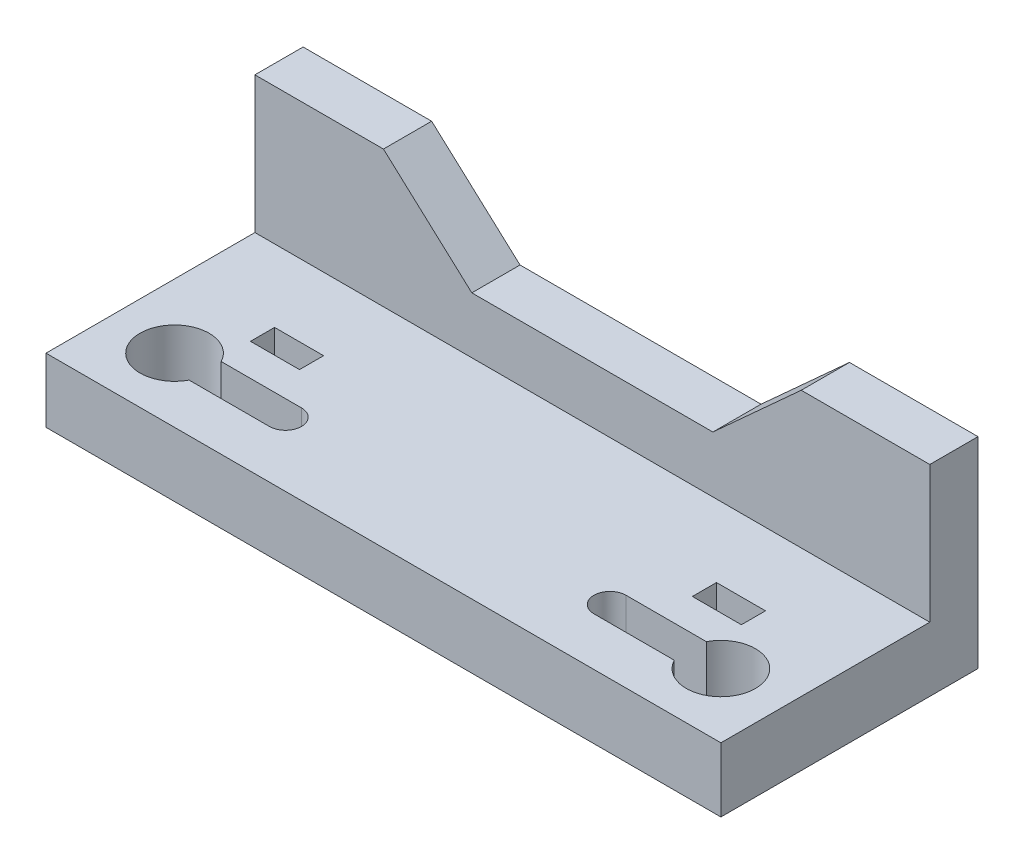
ISO-10303-21;
HEADER;
FILE_DESCRIPTION(('STEP AP214'),'2;1');
FILE_NAME('part.step','',(''),(''),'','','');
FILE_SCHEMA(('AUTOMOTIVE_DESIGN { 1 0 10303 214 1 1 1 1 }'));
ENDSEC;
DATA;
#1=APPLICATION_CONTEXT('core data for automotive mechanical design processes');
#2=APPLICATION_PROTOCOL_DEFINITION('international standard','automotive_design',2000,#1);
#3=PRODUCT_CONTEXT('',#1,'mechanical');
#4=PRODUCT('Part','Part','',(#3));
#5=PRODUCT_RELATED_PRODUCT_CATEGORY('part','',(#4));
#6=PRODUCT_DEFINITION_FORMATION('','',#4);
#7=PRODUCT_DEFINITION_CONTEXT('part definition',#1,'design');
#8=PRODUCT_DEFINITION('design','',#6,#7);
#9=PRODUCT_DEFINITION_SHAPE('','',#8);
#10=(LENGTH_UNIT() NAMED_UNIT(*) SI_UNIT(.MILLI.,.METRE.));
#11=(NAMED_UNIT(*) PLANE_ANGLE_UNIT() SI_UNIT($,.RADIAN.));
#12=(NAMED_UNIT(*) SI_UNIT($,.STERADIAN.) SOLID_ANGLE_UNIT());
#13=UNCERTAINTY_MEASURE_WITH_UNIT(LENGTH_MEASURE(1.E-05),#10,'distance_accuracy_value','');
#14=(GEOMETRIC_REPRESENTATION_CONTEXT(3) GLOBAL_UNCERTAINTY_ASSIGNED_CONTEXT((#13)) GLOBAL_UNIT_ASSIGNED_CONTEXT((#10,
#11,#12)) REPRESENTATION_CONTEXT('',''));
#15=CARTESIAN_POINT('',(0.,0.,0.));
#16=DIRECTION('',(0.,0.,1.));
#17=DIRECTION('',(1.,0.,0.));
#18=AXIS2_PLACEMENT_3D('',#15,#16,#17);
#19=CARTESIAN_POINT('',(0.,8.,0.));
#20=DIRECTION('',(0.,1.,0.));
#21=DIRECTION('',(0.,0.,1.));
#22=AXIS2_PLACEMENT_3D('',#19,#20,#21);
#23=PLANE('',#22);
#24=DIRECTION('',(1.,0.,0.));
#25=VECTOR('',#24,1.);
#26=CARTESIAN_POINT('',(0.,8.,-17.));
#27=LINE('',#26,#25);
#28=CARTESIAN_POINT('',(-30.55,8.,-17.));
#29=VERTEX_POINT('',#28);
#30=CARTESIAN_POINT('',(-24.45,8.,-17.));
#31=VERTEX_POINT('',#30);
#32=EDGE_CURVE('E192',#29,#31,#27,.T.);
#33=ORIENTED_EDGE('',*,*,#32,.T.);
#34=DIRECTION('',(0.,0.,1.));
#35=VECTOR('',#34,1.);
#36=CARTESIAN_POINT('',(-24.45,8.,0.));
#37=LINE('',#36,#35);
#38=CARTESIAN_POINT('',(-24.45,8.,-14.));
#39=VERTEX_POINT('',#38);
#40=EDGE_CURVE('E186',#31,#39,#37,.T.);
#41=ORIENTED_EDGE('',*,*,#40,.T.);
#42=DIRECTION('',(1.,0.,0.));
#43=VECTOR('',#42,1.);
#44=CARTESIAN_POINT('',(0.,8.,-14.));
#45=LINE('',#44,#43);
#46=CARTESIAN_POINT('',(-30.55,8.,-14.));
#47=VERTEX_POINT('',#46);
#48=EDGE_CURVE('E191',#47,#39,#45,.T.);
#49=ORIENTED_EDGE('',*,*,#48,.F.);
#50=DIRECTION('',(0.,0.,1.));
#51=VECTOR('',#50,1.);
#52=CARTESIAN_POINT('',(-30.55,8.,0.));
#53=LINE('',#52,#51);
#54=EDGE_CURVE('E205',#29,#47,#53,.T.);
#55=ORIENTED_EDGE('',*,*,#54,.F.);
#56=EDGE_LOOP('',(#33,#41,#49,#55));
#57=FACE_BOUND('',#56,.T.);
#58=DIRECTION('',(-1.,0.,0.));
#59=VECTOR('',#58,1.);
#60=CARTESIAN_POINT('',(0.,8.,-17.));
#61=LINE('',#60,#59);
#62=CARTESIAN_POINT('',(30.55,8.,-17.));
#63=VERTEX_POINT('',#62);
#64=CARTESIAN_POINT('',(24.45,8.,-17.));
#65=VERTEX_POINT('',#64);
#66=EDGE_CURVE('E405',#63,#65,#61,.T.);
#67=ORIENTED_EDGE('',*,*,#66,.F.);
#68=DIRECTION('',(0.,0.,1.));
#69=VECTOR('',#68,1.);
#70=CARTESIAN_POINT('',(30.55,8.,0.));
#71=LINE('',#70,#69);
#72=CARTESIAN_POINT('',(30.55,8.,-14.));
#73=VERTEX_POINT('',#72);
#74=EDGE_CURVE('E408',#63,#73,#71,.T.);
#75=ORIENTED_EDGE('',*,*,#74,.T.);
#76=DIRECTION('',(-1.,0.,0.));
#77=VECTOR('',#76,1.);
#78=CARTESIAN_POINT('',(0.,8.,-14.));
#79=LINE('',#78,#77);
#80=CARTESIAN_POINT('',(24.45,8.,-14.));
#81=VERTEX_POINT('',#80);
#82=EDGE_CURVE('E411',#73,#81,#79,.T.);
#83=ORIENTED_EDGE('',*,*,#82,.T.);
#84=DIRECTION('',(0.,0.,1.));
#85=VECTOR('',#84,1.);
#86=CARTESIAN_POINT('',(24.45,8.,0.));
#87=LINE('',#86,#85);
#88=EDGE_CURVE('E412',#65,#81,#87,.T.);
#89=ORIENTED_EDGE('',*,*,#88,.F.);
#90=EDGE_LOOP('',(#67,#75,#83,#89));
#91=FACE_BOUND('',#90,.T.);
#92=CARTESIAN_POINT('',(-34.,8.,-8.));
#93=DIRECTION('',(0.,1.,0.));
#94=DIRECTION('',(0.,0.,1.));
#95=AXIS2_PLACEMENT_3D('',#92,#93,#94);
#96=CIRCLE('',#95,4.3);
#97=CARTESIAN_POINT('',(-30.1934267378651,8.,-10.));
#98=VERTEX_POINT('',#97);
#99=CARTESIAN_POINT('',(-30.1934267378651,8.,-6.));
#100=VERTEX_POINT('',#99);
#101=EDGE_CURVE('E394',#98,#100,#96,.T.);
#102=ORIENTED_EDGE('',*,*,#101,.F.);
#103=DIRECTION('',(1.,0.,0.));
#104=VECTOR('',#103,1.);
#105=CARTESIAN_POINT('',(0.,8.,-9.99999999999999));
#106=LINE('',#105,#104);
#107=CARTESIAN_POINT('',(-20.1934267378651,8.,-10.));
#108=VERTEX_POINT('',#107);
#109=EDGE_CURVE('E397',#98,#108,#106,.T.);
#110=ORIENTED_EDGE('',*,*,#109,.T.);
#111=CARTESIAN_POINT('',(-20.1934267378651,8.,-8.));
#112=DIRECTION('',(0.,1.,0.));
#113=DIRECTION('',(0.,0.,1.));
#114=AXIS2_PLACEMENT_3D('',#111,#112,#113);
#115=CIRCLE('',#114,2.);
#116=CARTESIAN_POINT('',(-20.1934267378651,8.,-6.));
#117=VERTEX_POINT('',#116);
#118=EDGE_CURVE('E400',#108,#117,#115,.F.);
#119=ORIENTED_EDGE('',*,*,#118,.T.);
#120=DIRECTION('',(1.,0.,0.));
#121=VECTOR('',#120,1.);
#122=CARTESIAN_POINT('',(0.,8.,-6.00000000000001));
#123=LINE('',#122,#121);
#124=EDGE_CURVE('E402',#100,#117,#123,.T.);
#125=ORIENTED_EDGE('',*,*,#124,.F.);
#126=EDGE_LOOP('',(#102,#110,#119,#125));
#127=FACE_BOUND('',#126,.T.);
#128=CARTESIAN_POINT('',(20.1934267378651,8.,-8.00000000000001));
#129=DIRECTION('',(0.,1.,0.));
#130=DIRECTION('',(0.,0.,1.));
#131=AXIS2_PLACEMENT_3D('',#128,#129,#130);
#132=CIRCLE('',#131,1.99999999999999);
#133=CARTESIAN_POINT('',(20.1934267378651,8.,-9.99999999999999));
#134=VERTEX_POINT('',#133);
#135=CARTESIAN_POINT('',(20.1934267378651,8.,-6.00000000000001));
#136=VERTEX_POINT('',#135);
#137=EDGE_CURVE('E267',#134,#136,#132,.T.);
#138=ORIENTED_EDGE('',*,*,#137,.F.);
#139=DIRECTION('',(-1.,0.,0.));
#140=VECTOR('',#139,1.);
#141=CARTESIAN_POINT('',(0.,8.,-10.));
#142=LINE('',#141,#140);
#143=CARTESIAN_POINT('',(30.1934267378651,8.,-9.99999999999999));
#144=VERTEX_POINT('',#143);
#145=EDGE_CURVE('E387',#144,#134,#142,.T.);
#146=ORIENTED_EDGE('',*,*,#145,.F.);
#147=CARTESIAN_POINT('',(34.,8.,-8.00000000000001));
#148=DIRECTION('',(0.,1.,0.));
#149=DIRECTION('',(0.,0.,1.));
#150=AXIS2_PLACEMENT_3D('',#147,#148,#149);
#151=CIRCLE('',#150,4.3);
#152=CARTESIAN_POINT('',(30.1934267378651,8.,-6.00000000000001));
#153=VERTEX_POINT('',#152);
#154=EDGE_CURVE('E390',#144,#153,#151,.F.);
#155=ORIENTED_EDGE('',*,*,#154,.T.);
#156=DIRECTION('',(-1.,0.,0.));
#157=VECTOR('',#156,1.);
#158=CARTESIAN_POINT('',(0.,8.,-6.00000000000001));
#159=LINE('',#158,#157);
#160=EDGE_CURVE('E392',#153,#136,#159,.T.);
#161=ORIENTED_EDGE('',*,*,#160,.T.);
#162=EDGE_LOOP('',(#138,#146,#155,#161));
#163=FACE_BOUND('',#162,.T.);
#164=DIRECTION('',(0.,0.,-1.));
#165=VECTOR('',#164,1.);
#166=CARTESIAN_POINT('',(42.,8.,0.));
#167=LINE('',#166,#165);
#168=CARTESIAN_POINT('',(42.,8.,0.));
#169=VERTEX_POINT('',#168);
#170=CARTESIAN_POINT('',(42.,8.,-26.));
#171=VERTEX_POINT('',#170);
#172=EDGE_CURVE('E304',#169,#171,#167,.T.);
#173=ORIENTED_EDGE('',*,*,#172,.T.);
#174=DIRECTION('',(-1.,0.,0.));
#175=VECTOR('',#174,1.);
#176=CARTESIAN_POINT('',(-42.,8.,-26.));
#177=LINE('',#176,#175);
#178=CARTESIAN_POINT('',(-42.,8.,-26.));
#179=VERTEX_POINT('',#178);
#180=EDGE_CURVE('E327',#171,#179,#177,.T.);
#181=ORIENTED_EDGE('',*,*,#180,.T.);
#182=DIRECTION('',(0.,0.,-1.));
#183=VECTOR('',#182,1.);
#184=CARTESIAN_POINT('',(-42.,8.,0.));
#185=LINE('',#184,#183);
#186=CARTESIAN_POINT('',(-42.,8.,0.));
#187=VERTEX_POINT('',#186);
#188=EDGE_CURVE('E308',#187,#179,#185,.T.);
#189=ORIENTED_EDGE('',*,*,#188,.F.);
#190=DIRECTION('',(1.,0.,0.));
#191=VECTOR('',#190,1.);
#192=CARTESIAN_POINT('',(0.,8.,0.));
#193=LINE('',#192,#191);
#194=EDGE_CURVE('E309',#187,#169,#193,.T.);
#195=ORIENTED_EDGE('',*,*,#194,.T.);
#196=EDGE_LOOP('',(#173,#181,#189,#195));
#197=FACE_BOUND('',#196,.T.);
#198=ADVANCED_FACE('F35',(#57,#91,#127,#163,#197),#23,.T.);
#199=CARTESIAN_POINT('',(0.,8.,-17.));
#200=DIRECTION('',(0.,0.,-1.));
#201=DIRECTION('',(-1.,0.,0.));
#202=AXIS2_PLACEMENT_3D('',#199,#200,#201);
#203=PLANE('',#202);
#204=DIRECTION('',(1.,0.,0.));
#205=VECTOR('',#204,1.);
#206=CARTESIAN_POINT('',(0.,0.,-17.));
#207=LINE('',#206,#205);
#208=CARTESIAN_POINT('',(-30.55,0.,-17.));
#209=VERTEX_POINT('',#208);
#210=CARTESIAN_POINT('',(-24.45,0.,-17.));
#211=VERTEX_POINT('',#210);
#212=EDGE_CURVE('E259',#209,#211,#207,.T.);
#213=ORIENTED_EDGE('',*,*,#212,.T.);
#214=DIRECTION('',(0.,-1.,0.));
#215=VECTOR('',#214,1.);
#216=CARTESIAN_POINT('',(-24.45,8.,-17.));
#217=LINE('',#216,#215);
#218=EDGE_CURVE('E11',#31,#211,#217,.T.);
#219=ORIENTED_EDGE('',*,*,#218,.F.);
#220=ORIENTED_EDGE('',*,*,#32,.F.);
#221=DIRECTION('',(0.,-1.,0.));
#222=VECTOR('',#221,1.);
#223=CARTESIAN_POINT('',(-30.55,8.,-17.));
#224=LINE('',#223,#222);
#225=EDGE_CURVE('E61',#29,#209,#224,.T.);
#226=ORIENTED_EDGE('',*,*,#225,.T.);
#227=EDGE_LOOP('',(#213,#219,#220,#226));
#228=FACE_BOUND('',#227,.T.);
#229=ADVANCED_FACE('F445',(#228),#203,.F.);
#230=CARTESIAN_POINT('',(-24.45,8.,0.));
#231=DIRECTION('',(1.,0.,0.));
#232=DIRECTION('',(0.,0.,-1.));
#233=AXIS2_PLACEMENT_3D('',#230,#231,#232);
#234=PLANE('',#233);
#235=DIRECTION('',(0.,0.,1.));
#236=VECTOR('',#235,1.);
#237=CARTESIAN_POINT('',(-24.45,0.,0.));
#238=LINE('',#237,#236);
#239=CARTESIAN_POINT('',(-24.45,0.,-14.));
#240=VERTEX_POINT('',#239);
#241=EDGE_CURVE('E198',#211,#240,#238,.T.);
#242=ORIENTED_EDGE('',*,*,#241,.T.);
#243=DIRECTION('',(0.,-1.,0.));
#244=VECTOR('',#243,1.);
#245=CARTESIAN_POINT('',(-24.45,8.,-14.));
#246=LINE('',#245,#244);
#247=EDGE_CURVE('E44',#39,#240,#246,.T.);
#248=ORIENTED_EDGE('',*,*,#247,.F.);
#249=ORIENTED_EDGE('',*,*,#40,.F.);
#250=ORIENTED_EDGE('',*,*,#218,.T.);
#251=EDGE_LOOP('',(#242,#248,#249,#250));
#252=FACE_BOUND('',#251,.T.);
#253=ADVANCED_FACE('F197',(#252),#234,.F.);
#254=CARTESIAN_POINT('',(0.,8.,-14.));
#255=DIRECTION('',(0.,0.,-1.));
#256=DIRECTION('',(-1.,0.,0.));
#257=AXIS2_PLACEMENT_3D('',#254,#255,#256);
#258=PLANE('',#257);
#259=DIRECTION('',(1.,0.,0.));
#260=VECTOR('',#259,1.);
#261=CARTESIAN_POINT('',(0.,0.,-14.));
#262=LINE('',#261,#260);
#263=CARTESIAN_POINT('',(-30.55,0.,-14.));
#264=VERTEX_POINT('',#263);
#265=EDGE_CURVE('E262',#264,#240,#262,.T.);
#266=ORIENTED_EDGE('',*,*,#265,.F.);
#267=DIRECTION('',(0.,-1.,0.));
#268=VECTOR('',#267,1.);
#269=CARTESIAN_POINT('',(-30.55,8.,-14.));
#270=LINE('',#269,#268);
#271=EDGE_CURVE('E202',#47,#264,#270,.T.);
#272=ORIENTED_EDGE('',*,*,#271,.F.);
#273=ORIENTED_EDGE('',*,*,#48,.T.);
#274=ORIENTED_EDGE('',*,*,#247,.T.);
#275=EDGE_LOOP('',(#266,#272,#273,#274));
#276=FACE_BOUND('',#275,.T.);
#277=ADVANCED_FACE('F204',(#276),#258,.T.);
#278=CARTESIAN_POINT('',(0.,8.,0.));
#279=DIRECTION('',(0.,0.,-1.));
#280=DIRECTION('',(-1.,0.,0.));
#281=AXIS2_PLACEMENT_3D('',#278,#279,#280);
#282=PLANE('',#281);
#283=DIRECTION('',(1.,0.,0.));
#284=VECTOR('',#283,1.);
#285=CARTESIAN_POINT('',(0.,0.,0.));
#286=LINE('',#285,#284);
#287=CARTESIAN_POINT('',(-42.,0.,0.));
#288=VERTEX_POINT('',#287);
#289=CARTESIAN_POINT('',(42.,0.,0.));
#290=VERTEX_POINT('',#289);
#291=EDGE_CURVE('E247',#288,#290,#286,.T.);
#292=ORIENTED_EDGE('',*,*,#291,.T.);
#293=DIRECTION('',(0.,-1.,0.));
#294=VECTOR('',#293,1.);
#295=CARTESIAN_POINT('',(42.,8.,0.));
#296=LINE('',#295,#294);
#297=EDGE_CURVE('E269',#169,#290,#296,.T.);
#298=ORIENTED_EDGE('',*,*,#297,.F.);
#299=ORIENTED_EDGE('',*,*,#194,.F.);
#300=DIRECTION('',(0.,-1.,0.));
#301=VECTOR('',#300,1.);
#302=CARTESIAN_POINT('',(-42.,8.,0.));
#303=LINE('',#302,#301);
#304=EDGE_CURVE('E271',#187,#288,#303,.T.);
#305=ORIENTED_EDGE('',*,*,#304,.T.);
#306=EDGE_LOOP('',(#292,#298,#299,#305));
#307=FACE_BOUND('',#306,.T.);
#308=ADVANCED_FACE('F465',(#307),#282,.F.);
#309=CARTESIAN_POINT('',(42.,8.,0.));
#310=DIRECTION('',(-1.,0.,0.));
#311=DIRECTION('',(0.,0.,1.));
#312=AXIS2_PLACEMENT_3D('',#309,#310,#311);
#313=PLANE('',#312);
#314=DIRECTION('',(0.,0.,-1.));
#315=VECTOR('',#314,1.);
#316=CARTESIAN_POINT('',(42.,0.,0.));
#317=LINE('',#316,#315);
#318=CARTESIAN_POINT('',(42.,0.,-32.));
#319=VERTEX_POINT('',#318);
#320=EDGE_CURVE('E250',#290,#319,#317,.T.);
#321=ORIENTED_EDGE('',*,*,#320,.T.);
#322=DIRECTION('',(0.,-1.,0.));
#323=VECTOR('',#322,1.);
#324=CARTESIAN_POINT('',(42.,8.,-32.));
#325=LINE('',#324,#323);
#326=CARTESIAN_POINT('',(42.,25.,-32.));
#327=VERTEX_POINT('',#326);
#328=EDGE_CURVE('E276',#327,#319,#325,.T.);
#329=ORIENTED_EDGE('',*,*,#328,.F.);
#330=DIRECTION('',(0.,0.,-1.));
#331=VECTOR('',#330,1.);
#332=CARTESIAN_POINT('',(42.,25.,-26.));
#333=LINE('',#332,#331);
#334=CARTESIAN_POINT('',(42.,25.,-26.));
#335=VERTEX_POINT('',#334);
#336=EDGE_CURVE('E215',#335,#327,#333,.T.);
#337=ORIENTED_EDGE('',*,*,#336,.F.);
#338=DIRECTION('',(0.,-1.,0.));
#339=VECTOR('',#338,1.);
#340=CARTESIAN_POINT('',(42.,8.,-26.));
#341=LINE('',#340,#339);
#342=EDGE_CURVE('E357',#335,#171,#341,.T.);
#343=ORIENTED_EDGE('',*,*,#342,.T.);
#344=ORIENTED_EDGE('',*,*,#172,.F.);
#345=ORIENTED_EDGE('',*,*,#297,.T.);
#346=EDGE_LOOP('',(#321,#329,#337,#343,#344,#345));
#347=FACE_BOUND('',#346,.T.);
#348=ADVANCED_FACE('F473',(#347),#313,.F.);
#349=CARTESIAN_POINT('',(0.,8.,-32.));
#350=DIRECTION('',(0.,0.,-1.));
#351=DIRECTION('',(-1.,0.,0.));
#352=AXIS2_PLACEMENT_3D('',#349,#350,#351);
#353=PLANE('',#352);
#354=CARTESIAN_POINT('',(32.,15.,-32.));
#355=DIRECTION('',(0.,0.,-1.));
#356=DIRECTION('',(1.,0.,0.));
#357=AXIS2_PLACEMENT_3D('',#354,#355,#356);
#358=CIRCLE('',#357,5.5);
#359=CARTESIAN_POINT('',(37.5,15.,-32.));
#360=VERTEX_POINT('',#359);
#361=EDGE_CURVE('E811',#360,#360,#358,.T.);
#362=ORIENTED_EDGE('',*,*,#361,.F.);
#363=EDGE_LOOP('',(#362));
#364=FACE_BOUND('',#363,.T.);
#365=CARTESIAN_POINT('',(-32.,15.,-32.));
#366=DIRECTION('',(0.,0.,-1.));
#367=DIRECTION('',(-1.,0.,0.));
#368=AXIS2_PLACEMENT_3D('',#365,#366,#367);
#369=CIRCLE('',#368,5.5);
#370=CARTESIAN_POINT('',(-37.5,15.,-32.));
#371=VERTEX_POINT('',#370);
#372=EDGE_CURVE('E341',#371,#371,#369,.T.);
#373=ORIENTED_EDGE('',*,*,#372,.F.);
#374=EDGE_LOOP('',(#373));
#375=FACE_BOUND('',#374,.T.);
#376=DIRECTION('',(1.,0.,0.));
#377=VECTOR('',#376,1.);
#378=CARTESIAN_POINT('',(0.,0.,-32.));
#379=LINE('',#378,#377);
#380=CARTESIAN_POINT('',(-42.,0.,-32.));
#381=VERTEX_POINT('',#380);
#382=EDGE_CURVE('E253',#381,#319,#379,.T.);
#383=ORIENTED_EDGE('',*,*,#382,.F.);
#384=DIRECTION('',(0.,-1.,0.));
#385=VECTOR('',#384,1.);
#386=CARTESIAN_POINT('',(-42.,8.,-32.));
#387=LINE('',#386,#385);
#388=CARTESIAN_POINT('',(-42.,25.,-32.));
#389=VERTEX_POINT('',#388);
#390=EDGE_CURVE('E273',#389,#381,#387,.T.);
#391=ORIENTED_EDGE('',*,*,#390,.F.);
#392=DIRECTION('',(1.,0.,0.));
#393=VECTOR('',#392,1.);
#394=CARTESIAN_POINT('',(-26.,25.,-32.));
#395=LINE('',#394,#393);
#396=CARTESIAN_POINT('',(-26.,25.,-32.));
#397=VERTEX_POINT('',#396);
#398=EDGE_CURVE('E358',#389,#397,#395,.T.);
#399=ORIENTED_EDGE('',*,*,#398,.T.);
#400=DIRECTION('',(0.739940073395944,-0.672672793996312,0.));
#401=VECTOR('',#400,1.);
#402=CARTESIAN_POINT('',(-15.,15.,-32.));
#403=LINE('',#402,#401);
#404=CARTESIAN_POINT('',(-15.,15.,-32.));
#405=VERTEX_POINT('',#404);
#406=EDGE_CURVE('E361',#397,#405,#403,.T.);
#407=ORIENTED_EDGE('',*,*,#406,.T.);
#408=DIRECTION('',(1.,0.,0.));
#409=VECTOR('',#408,1.);
#410=CARTESIAN_POINT('',(15.,15.,-32.));
#411=LINE('',#410,#409);
#412=CARTESIAN_POINT('',(15.,15.,-32.));
#413=VERTEX_POINT('',#412);
#414=EDGE_CURVE('E365',#405,#413,#411,.T.);
#415=ORIENTED_EDGE('',*,*,#414,.T.);
#416=DIRECTION('',(0.739940073395944,0.672672793996312,0.));
#417=VECTOR('',#416,1.);
#418=CARTESIAN_POINT('',(26.,25.,-32.));
#419=LINE('',#418,#417);
#420=CARTESIAN_POINT('',(26.,25.,-32.));
#421=VERTEX_POINT('',#420);
#422=EDGE_CURVE('E334',#413,#421,#419,.T.);
#423=ORIENTED_EDGE('',*,*,#422,.T.);
#424=DIRECTION('',(1.,0.,0.));
#425=VECTOR('',#424,1.);
#426=CARTESIAN_POINT('',(42.,25.,-32.));
#427=LINE('',#426,#425);
#428=EDGE_CURVE('E330',#421,#327,#427,.T.);
#429=ORIENTED_EDGE('',*,*,#428,.T.);
#430=ORIENTED_EDGE('',*,*,#328,.T.);
#431=EDGE_LOOP('',(#383,#391,#399,#407,#415,#423,#429,#430));
#432=FACE_BOUND('',#431,.T.);
#433=ADVANCED_FACE('F442',(#364,#375,#432),#353,.T.);
#434=CARTESIAN_POINT('',(0.,8.,-17.));
#435=DIRECTION('',(0.,0.,1.));
#436=DIRECTION('',(1.,0.,0.));
#437=AXIS2_PLACEMENT_3D('',#434,#435,#436);
#438=PLANE('',#437);
#439=DIRECTION('',(-1.,0.,0.));
#440=VECTOR('',#439,1.);
#441=CARTESIAN_POINT('',(0.,0.,-17.));
#442=LINE('',#441,#440);
#443=CARTESIAN_POINT('',(30.55,0.,-17.));
#444=VERTEX_POINT('',#443);
#445=CARTESIAN_POINT('',(24.45,0.,-17.));
#446=VERTEX_POINT('',#445);
#447=EDGE_CURVE('E235',#444,#446,#442,.T.);
#448=ORIENTED_EDGE('',*,*,#447,.F.);
#449=DIRECTION('',(0.,-1.,0.));
#450=VECTOR('',#449,1.);
#451=CARTESIAN_POINT('',(30.55,8.,-17.));
#452=LINE('',#451,#450);
#453=EDGE_CURVE('E274',#63,#444,#452,.T.);
#454=ORIENTED_EDGE('',*,*,#453,.F.);
#455=ORIENTED_EDGE('',*,*,#66,.T.);
#456=DIRECTION('',(0.,-1.,0.));
#457=VECTOR('',#456,1.);
#458=CARTESIAN_POINT('',(24.45,8.,-17.));
#459=LINE('',#458,#457);
#460=EDGE_CURVE('E280',#65,#446,#459,.T.);
#461=ORIENTED_EDGE('',*,*,#460,.T.);
#462=EDGE_LOOP('',(#448,#454,#455,#461));
#463=FACE_BOUND('',#462,.T.);
#464=ADVANCED_FACE('F431',(#463),#438,.T.);
#465=CARTESIAN_POINT('',(30.55,8.,0.));
#466=DIRECTION('',(1.,0.,0.));
#467=DIRECTION('',(0.,0.,-1.));
#468=AXIS2_PLACEMENT_3D('',#465,#466,#467);
#469=PLANE('',#468);
#470=DIRECTION('',(0.,0.,1.));
#471=VECTOR('',#470,1.);
#472=CARTESIAN_POINT('',(30.55,0.,0.));
#473=LINE('',#472,#471);
#474=CARTESIAN_POINT('',(30.55,0.,-14.));
#475=VERTEX_POINT('',#474);
#476=EDGE_CURVE('E238',#444,#475,#473,.T.);
#477=ORIENTED_EDGE('',*,*,#476,.T.);
#478=DIRECTION('',(0.,-1.,0.));
#479=VECTOR('',#478,1.);
#480=CARTESIAN_POINT('',(30.55,8.,-14.));
#481=LINE('',#480,#479);
#482=EDGE_CURVE('E285',#73,#475,#481,.T.);
#483=ORIENTED_EDGE('',*,*,#482,.F.);
#484=ORIENTED_EDGE('',*,*,#74,.F.);
#485=ORIENTED_EDGE('',*,*,#453,.T.);
#486=EDGE_LOOP('',(#477,#483,#484,#485));
#487=FACE_BOUND('',#486,.T.);
#488=ADVANCED_FACE('F433',(#487),#469,.F.);
#489=CARTESIAN_POINT('',(0.,8.,-14.));
#490=DIRECTION('',(0.,0.,1.));
#491=DIRECTION('',(1.,0.,0.));
#492=AXIS2_PLACEMENT_3D('',#489,#490,#491);
#493=PLANE('',#492);
#494=DIRECTION('',(-1.,0.,0.));
#495=VECTOR('',#494,1.);
#496=CARTESIAN_POINT('',(0.,0.,-14.));
#497=LINE('',#496,#495);
#498=CARTESIAN_POINT('',(24.45,0.,-14.));
#499=VERTEX_POINT('',#498);
#500=EDGE_CURVE('E241',#475,#499,#497,.T.);
#501=ORIENTED_EDGE('',*,*,#500,.T.);
#502=DIRECTION('',(0.,-1.,0.));
#503=VECTOR('',#502,1.);
#504=CARTESIAN_POINT('',(24.45,8.,-14.));
#505=LINE('',#504,#503);
#506=EDGE_CURVE('E282',#81,#499,#505,.T.);
#507=ORIENTED_EDGE('',*,*,#506,.F.);
#508=ORIENTED_EDGE('',*,*,#82,.F.);
#509=ORIENTED_EDGE('',*,*,#482,.T.);
#510=EDGE_LOOP('',(#501,#507,#508,#509));
#511=FACE_BOUND('',#510,.T.);
#512=ADVANCED_FACE('F424',(#511),#493,.F.);
#513=CARTESIAN_POINT('',(-34.,8.,-8.));
#514=DIRECTION('',(0.,-1.,0.));
#515=DIRECTION('',(0.,0.,-1.));
#516=AXIS2_PLACEMENT_3D('',#513,#514,#515);
#517=CYLINDRICAL_SURFACE('',#516,4.3);
#518=CARTESIAN_POINT('',(-34.,0.,-8.));
#519=DIRECTION('',(0.,1.,0.));
#520=DIRECTION('',(0.,0.,1.));
#521=AXIS2_PLACEMENT_3D('',#518,#519,#520);
#522=CIRCLE('',#521,4.3);
#523=CARTESIAN_POINT('',(-30.1934267378651,0.,-10.));
#524=VERTEX_POINT('',#523);
#525=CARTESIAN_POINT('',(-30.1934267378651,0.,-6.));
#526=VERTEX_POINT('',#525);
#527=EDGE_CURVE('E223',#524,#526,#522,.T.);
#528=ORIENTED_EDGE('',*,*,#527,.F.);
#529=DIRECTION('',(0.,-1.,0.));
#530=VECTOR('',#529,1.);
#531=CARTESIAN_POINT('',(-30.1934267378651,8.,-10.));
#532=LINE('',#531,#530);
#533=EDGE_CURVE('E283',#98,#524,#532,.T.);
#534=ORIENTED_EDGE('',*,*,#533,.F.);
#535=ORIENTED_EDGE('',*,*,#101,.T.);
#536=DIRECTION('',(0.,-1.,0.));
#537=VECTOR('',#536,1.);
#538=CARTESIAN_POINT('',(-30.1934267378651,8.,-6.));
#539=LINE('',#538,#537);
#540=EDGE_CURVE('E289',#100,#526,#539,.T.);
#541=ORIENTED_EDGE('',*,*,#540,.T.);
#542=EDGE_LOOP('',(#528,#534,#535,#541));
#543=FACE_BOUND('',#542,.T.);
#544=ADVANCED_FACE('F440',(#543),#517,.F.);
#545=CARTESIAN_POINT('',(0.,8.,-9.99999999999999));
#546=DIRECTION('',(0.,0.,-1.));
#547=DIRECTION('',(-1.,0.,0.));
#548=AXIS2_PLACEMENT_3D('',#545,#546,#547);
#549=PLANE('',#548);
#550=DIRECTION('',(1.,0.,0.));
#551=VECTOR('',#550,1.);
#552=CARTESIAN_POINT('',(0.,0.,-9.99999999999999));
#553=LINE('',#552,#551);
#554=CARTESIAN_POINT('',(-20.1934267378651,0.,-10.));
#555=VERTEX_POINT('',#554);
#556=EDGE_CURVE('E226',#524,#555,#553,.T.);
#557=ORIENTED_EDGE('',*,*,#556,.T.);
#558=DIRECTION('',(0.,-1.,0.));
#559=VECTOR('',#558,1.);
#560=CARTESIAN_POINT('',(-20.1934267378651,8.,-10.));
#561=LINE('',#560,#559);
#562=EDGE_CURVE('E293',#108,#555,#561,.T.);
#563=ORIENTED_EDGE('',*,*,#562,.F.);
#564=ORIENTED_EDGE('',*,*,#109,.F.);
#565=ORIENTED_EDGE('',*,*,#533,.T.);
#566=EDGE_LOOP('',(#557,#563,#564,#565));
#567=FACE_BOUND('',#566,.T.);
#568=ADVANCED_FACE('F498',(#567),#549,.F.);
#569=CARTESIAN_POINT('',(-20.1934267378651,8.,-8.));
#570=DIRECTION('',(0.,-1.,0.));
#571=DIRECTION('',(0.,0.,-1.));
#572=AXIS2_PLACEMENT_3D('',#569,#570,#571);
#573=CYLINDRICAL_SURFACE('',#572,2.);
#574=CARTESIAN_POINT('',(-20.1934267378651,0.,-8.));
#575=DIRECTION('',(0.,1.,0.));
#576=DIRECTION('',(0.,0.,1.));
#577=AXIS2_PLACEMENT_3D('',#574,#575,#576);
#578=CIRCLE('',#577,2.);
#579=CARTESIAN_POINT('',(-20.1934267378651,0.,-6.));
#580=VERTEX_POINT('',#579);
#581=EDGE_CURVE('E229',#555,#580,#578,.F.);
#582=ORIENTED_EDGE('',*,*,#581,.T.);
#583=DIRECTION('',(0.,-1.,0.));
#584=VECTOR('',#583,1.);
#585=CARTESIAN_POINT('',(-20.1934267378651,8.,-6.));
#586=LINE('',#585,#584);
#587=EDGE_CURVE('E291',#117,#580,#586,.T.);
#588=ORIENTED_EDGE('',*,*,#587,.F.);
#589=ORIENTED_EDGE('',*,*,#118,.F.);
#590=ORIENTED_EDGE('',*,*,#562,.T.);
#591=EDGE_LOOP('',(#582,#588,#589,#590));
#592=FACE_BOUND('',#591,.T.);
#593=ADVANCED_FACE('F495',(#592),#573,.F.);
#594=CARTESIAN_POINT('',(20.1934267378651,8.,-8.00000000000001));
#595=DIRECTION('',(0.,-1.,0.));
#596=DIRECTION('',(0.,0.,-1.));
#597=AXIS2_PLACEMENT_3D('',#594,#595,#596);
#598=CYLINDRICAL_SURFACE('',#597,1.99999999999999);
#599=CARTESIAN_POINT('',(20.1934267378651,0.,-8.00000000000001));
#600=DIRECTION('',(0.,1.,0.));
#601=DIRECTION('',(0.,0.,1.));
#602=AXIS2_PLACEMENT_3D('',#599,#600,#601);
#603=CIRCLE('',#602,1.99999999999999);
#604=CARTESIAN_POINT('',(20.1934267378651,0.,-9.99999999999999));
#605=VERTEX_POINT('',#604);
#606=CARTESIAN_POINT('',(20.1934267378651,0.,-6.00000000000001));
#607=VERTEX_POINT('',#606);
#608=EDGE_CURVE('E211',#605,#607,#603,.T.);
#609=ORIENTED_EDGE('',*,*,#608,.F.);
#610=DIRECTION('',(0.,-1.,0.));
#611=VECTOR('',#610,1.);
#612=CARTESIAN_POINT('',(20.1934267378651,8.,-9.99999999999999));
#613=LINE('',#612,#611);
#614=EDGE_CURVE('E136',#134,#605,#613,.T.);
#615=ORIENTED_EDGE('',*,*,#614,.F.);
#616=ORIENTED_EDGE('',*,*,#137,.T.);
#617=DIRECTION('',(0.,-1.,0.));
#618=VECTOR('',#617,1.);
#619=CARTESIAN_POINT('',(20.1934267378651,8.,-6.00000000000001));
#620=LINE('',#619,#618);
#621=EDGE_CURVE('E207',#136,#607,#620,.T.);
#622=ORIENTED_EDGE('',*,*,#621,.T.);
#623=EDGE_LOOP('',(#609,#615,#616,#622));
#624=FACE_BOUND('',#623,.T.);
#625=ADVANCED_FACE('F37',(#624),#598,.F.);
#626=CARTESIAN_POINT('',(0.,8.,-10.));
#627=DIRECTION('',(0.,0.,1.));
#628=DIRECTION('',(1.,0.,0.));
#629=AXIS2_PLACEMENT_3D('',#626,#627,#628);
#630=PLANE('',#629);
#631=DIRECTION('',(-1.,0.,0.));
#632=VECTOR('',#631,1.);
#633=CARTESIAN_POINT('',(0.,0.,-10.));
#634=LINE('',#633,#632);
#635=CARTESIAN_POINT('',(30.1934267378651,0.,-9.99999999999999));
#636=VERTEX_POINT('',#635);
#637=EDGE_CURVE('E214',#636,#605,#634,.T.);
#638=ORIENTED_EDGE('',*,*,#637,.F.);
#639=DIRECTION('',(0.,-1.,0.));
#640=VECTOR('',#639,1.);
#641=CARTESIAN_POINT('',(30.1934267378651,8.,-9.99999999999999));
#642=LINE('',#641,#640);
#643=EDGE_CURVE('E301',#144,#636,#642,.T.);
#644=ORIENTED_EDGE('',*,*,#643,.F.);
#645=ORIENTED_EDGE('',*,*,#145,.T.);
#646=ORIENTED_EDGE('',*,*,#614,.T.);
#647=EDGE_LOOP('',(#638,#644,#645,#646));
#648=FACE_BOUND('',#647,.T.);
#649=ADVANCED_FACE('F507',(#648),#630,.T.);
#650=CARTESIAN_POINT('',(34.,8.,-8.00000000000001));
#651=DIRECTION('',(0.,-1.,0.));
#652=DIRECTION('',(0.,0.,-1.));
#653=AXIS2_PLACEMENT_3D('',#650,#651,#652);
#654=CYLINDRICAL_SURFACE('',#653,4.3);
#655=CARTESIAN_POINT('',(34.,0.,-8.00000000000001));
#656=DIRECTION('',(0.,1.,0.));
#657=DIRECTION('',(0.,0.,1.));
#658=AXIS2_PLACEMENT_3D('',#655,#656,#657);
#659=CIRCLE('',#658,4.3);
#660=CARTESIAN_POINT('',(30.1934267378651,0.,-6.00000000000001));
#661=VERTEX_POINT('',#660);
#662=EDGE_CURVE('E218',#636,#661,#659,.F.);
#663=ORIENTED_EDGE('',*,*,#662,.T.);
#664=DIRECTION('',(0.,-1.,0.));
#665=VECTOR('',#664,1.);
#666=CARTESIAN_POINT('',(30.1934267378651,8.,-6.00000000000001));
#667=LINE('',#666,#665);
#668=EDGE_CURVE('E298',#153,#661,#667,.T.);
#669=ORIENTED_EDGE('',*,*,#668,.F.);
#670=ORIENTED_EDGE('',*,*,#154,.F.);
#671=ORIENTED_EDGE('',*,*,#643,.T.);
#672=EDGE_LOOP('',(#663,#669,#670,#671));
#673=FACE_BOUND('',#672,.T.);
#674=ADVANCED_FACE('F470',(#673),#654,.F.);
#675=CARTESIAN_POINT('',(-42.,8.,0.));
#676=DIRECTION('',(-1.,0.,0.));
#677=DIRECTION('',(0.,0.,1.));
#678=AXIS2_PLACEMENT_3D('',#675,#676,#677);
#679=PLANE('',#678);
#680=DIRECTION('',(0.,0.,-1.));
#681=VECTOR('',#680,1.);
#682=CARTESIAN_POINT('',(-42.,0.,0.));
#683=LINE('',#682,#681);
#684=EDGE_CURVE('E256',#288,#381,#683,.T.);
#685=ORIENTED_EDGE('',*,*,#684,.F.);
#686=ORIENTED_EDGE('',*,*,#304,.F.);
#687=ORIENTED_EDGE('',*,*,#188,.T.);
#688=DIRECTION('',(0.,1.,0.));
#689=VECTOR('',#688,1.);
#690=CARTESIAN_POINT('',(-42.,25.,-26.));
#691=LINE('',#690,#689);
#692=CARTESIAN_POINT('',(-42.,25.,-26.));
#693=VERTEX_POINT('',#692);
#694=EDGE_CURVE('E52',#179,#693,#691,.T.);
#695=ORIENTED_EDGE('',*,*,#694,.T.);
#696=DIRECTION('',(0.,0.,-1.));
#697=VECTOR('',#696,1.);
#698=CARTESIAN_POINT('',(-42.,25.,-26.));
#699=LINE('',#698,#697);
#700=EDGE_CURVE('E384',#693,#389,#699,.T.);
#701=ORIENTED_EDGE('',*,*,#700,.T.);
#702=ORIENTED_EDGE('',*,*,#390,.T.);
#703=EDGE_LOOP('',(#685,#686,#687,#695,#701,#702));
#704=FACE_BOUND('',#703,.T.);
#705=ADVANCED_FACE('F320',(#704),#679,.T.);
#706=CARTESIAN_POINT('',(24.45,8.,0.));
#707=DIRECTION('',(1.,0.,0.));
#708=DIRECTION('',(0.,0.,-1.));
#709=AXIS2_PLACEMENT_3D('',#706,#707,#708);
#710=PLANE('',#709);
#711=DIRECTION('',(0.,0.,1.));
#712=VECTOR('',#711,1.);
#713=CARTESIAN_POINT('',(24.45,0.,0.));
#714=LINE('',#713,#712);
#715=EDGE_CURVE('E244',#446,#499,#714,.T.);
#716=ORIENTED_EDGE('',*,*,#715,.F.);
#717=ORIENTED_EDGE('',*,*,#460,.F.);
#718=ORIENTED_EDGE('',*,*,#88,.T.);
#719=ORIENTED_EDGE('',*,*,#506,.T.);
#720=EDGE_LOOP('',(#716,#717,#718,#719));
#721=FACE_BOUND('',#720,.T.);
#722=ADVANCED_FACE('F417',(#721),#710,.T.);
#723=CARTESIAN_POINT('',(0.,8.,-6.00000000000001));
#724=DIRECTION('',(0.,0.,-1.));
#725=DIRECTION('',(-1.,0.,0.));
#726=AXIS2_PLACEMENT_3D('',#723,#724,#725);
#727=PLANE('',#726);
#728=DIRECTION('',(1.,0.,0.));
#729=VECTOR('',#728,1.);
#730=CARTESIAN_POINT('',(0.,0.,-6.00000000000001));
#731=LINE('',#730,#729);
#732=EDGE_CURVE('E232',#526,#580,#731,.T.);
#733=ORIENTED_EDGE('',*,*,#732,.F.);
#734=ORIENTED_EDGE('',*,*,#540,.F.);
#735=ORIENTED_EDGE('',*,*,#124,.T.);
#736=ORIENTED_EDGE('',*,*,#587,.T.);
#737=EDGE_LOOP('',(#733,#734,#735,#736));
#738=FACE_BOUND('',#737,.T.);
#739=ADVANCED_FACE('F482',(#738),#727,.T.);
#740=CARTESIAN_POINT('',(0.,8.,-6.00000000000001));
#741=DIRECTION('',(0.,0.,1.));
#742=DIRECTION('',(1.,0.,0.));
#743=AXIS2_PLACEMENT_3D('',#740,#741,#742);
#744=PLANE('',#743);
#745=DIRECTION('',(-1.,0.,0.));
#746=VECTOR('',#745,1.);
#747=CARTESIAN_POINT('',(0.,0.,-6.00000000000001));
#748=LINE('',#747,#746);
#749=EDGE_CURVE('E220',#661,#607,#748,.T.);
#750=ORIENTED_EDGE('',*,*,#749,.T.);
#751=ORIENTED_EDGE('',*,*,#621,.F.);
#752=ORIENTED_EDGE('',*,*,#160,.F.);
#753=ORIENTED_EDGE('',*,*,#668,.T.);
#754=EDGE_LOOP('',(#750,#751,#752,#753));
#755=FACE_BOUND('',#754,.T.);
#756=ADVANCED_FACE('F462',(#755),#744,.F.);
#757=CARTESIAN_POINT('',(-30.55,8.,0.));
#758=DIRECTION('',(1.,0.,0.));
#759=DIRECTION('',(0.,0.,-1.));
#760=AXIS2_PLACEMENT_3D('',#757,#758,#759);
#761=PLANE('',#760);
#762=DIRECTION('',(0.,0.,1.));
#763=VECTOR('',#762,1.);
#764=CARTESIAN_POINT('',(-30.55,0.,0.));
#765=LINE('',#764,#763);
#766=EDGE_CURVE('E264',#209,#264,#765,.T.);
#767=ORIENTED_EDGE('',*,*,#766,.F.);
#768=ORIENTED_EDGE('',*,*,#225,.F.);
#769=ORIENTED_EDGE('',*,*,#54,.T.);
#770=ORIENTED_EDGE('',*,*,#271,.T.);
#771=EDGE_LOOP('',(#767,#768,#769,#770));
#772=FACE_BOUND('',#771,.T.);
#773=ADVANCED_FACE('F458',(#772),#761,.T.);
#774=CARTESIAN_POINT('',(0.,0.,0.));
#775=DIRECTION('',(0.,1.,0.));
#776=DIRECTION('',(0.,0.,1.));
#777=AXIS2_PLACEMENT_3D('',#774,#775,#776);
#778=PLANE('',#777);
#779=ORIENTED_EDGE('',*,*,#608,.T.);
#780=ORIENTED_EDGE('',*,*,#749,.F.);
#781=ORIENTED_EDGE('',*,*,#662,.F.);
#782=ORIENTED_EDGE('',*,*,#637,.T.);
#783=EDGE_LOOP('',(#779,#780,#781,#782));
#784=FACE_BOUND('',#783,.T.);
#785=ORIENTED_EDGE('',*,*,#527,.T.);
#786=ORIENTED_EDGE('',*,*,#732,.T.);
#787=ORIENTED_EDGE('',*,*,#581,.F.);
#788=ORIENTED_EDGE('',*,*,#556,.F.);
#789=EDGE_LOOP('',(#785,#786,#787,#788));
#790=FACE_BOUND('',#789,.T.);
#791=ORIENTED_EDGE('',*,*,#447,.T.);
#792=ORIENTED_EDGE('',*,*,#715,.T.);
#793=ORIENTED_EDGE('',*,*,#500,.F.);
#794=ORIENTED_EDGE('',*,*,#476,.F.);
#795=EDGE_LOOP('',(#791,#792,#793,#794));
#796=FACE_BOUND('',#795,.T.);
#797=ORIENTED_EDGE('',*,*,#291,.F.);
#798=ORIENTED_EDGE('',*,*,#684,.T.);
#799=ORIENTED_EDGE('',*,*,#382,.T.);
#800=ORIENTED_EDGE('',*,*,#320,.F.);
#801=EDGE_LOOP('',(#797,#798,#799,#800));
#802=FACE_BOUND('',#801,.T.);
#803=ORIENTED_EDGE('',*,*,#212,.F.);
#804=ORIENTED_EDGE('',*,*,#766,.T.);
#805=ORIENTED_EDGE('',*,*,#265,.T.);
#806=ORIENTED_EDGE('',*,*,#241,.F.);
#807=EDGE_LOOP('',(#803,#804,#805,#806));
#808=FACE_BOUND('',#807,.T.);
#809=ADVANCED_FACE('F427',(#784,#790,#796,#802,#808),#778,.F.);
#810=CARTESIAN_POINT('',(42.,25.,-26.));
#811=DIRECTION('',(0.,1.,0.));
#812=DIRECTION('',(0.,0.,1.));
#813=AXIS2_PLACEMENT_3D('',#810,#811,#812);
#814=PLANE('',#813);
#815=ORIENTED_EDGE('',*,*,#428,.F.);
#816=DIRECTION('',(0.,0.,-1.));
#817=VECTOR('',#816,1.);
#818=CARTESIAN_POINT('',(26.,25.,-26.));
#819=LINE('',#818,#817);
#820=CARTESIAN_POINT('',(26.,25.,-26.));
#821=VERTEX_POINT('',#820);
#822=EDGE_CURVE('E372',#821,#421,#819,.T.);
#823=ORIENTED_EDGE('',*,*,#822,.F.);
#824=DIRECTION('',(1.,0.,0.));
#825=VECTOR('',#824,1.);
#826=CARTESIAN_POINT('',(42.,25.,-26.));
#827=LINE('',#826,#825);
#828=EDGE_CURVE('E354',#821,#335,#827,.T.);
#829=ORIENTED_EDGE('',*,*,#828,.T.);
#830=ORIENTED_EDGE('',*,*,#336,.T.);
#831=EDGE_LOOP('',(#815,#823,#829,#830));
#832=FACE_BOUND('',#831,.T.);
#833=ADVANCED_FACE('F457',(#832),#814,.T.);
#834=CARTESIAN_POINT('',(26.,25.,-26.));
#835=DIRECTION('',(-0.672672793996312,0.739940073395944,0.));
#836=DIRECTION('',(-0.739940073395944,-0.672672793996312,0.));
#837=AXIS2_PLACEMENT_3D('',#834,#835,#836);
#838=PLANE('',#837);
#839=ORIENTED_EDGE('',*,*,#422,.F.);
#840=DIRECTION('',(0.,0.,-1.));
#841=VECTOR('',#840,1.);
#842=CARTESIAN_POINT('',(15.,15.,-26.));
#843=LINE('',#842,#841);
#844=CARTESIAN_POINT('',(15.,15.,-26.));
#845=VERTEX_POINT('',#844);
#846=EDGE_CURVE('E375',#845,#413,#843,.T.);
#847=ORIENTED_EDGE('',*,*,#846,.F.);
#848=DIRECTION('',(0.739940073395944,0.672672793996312,0.));
#849=VECTOR('',#848,1.);
#850=CARTESIAN_POINT('',(26.,25.,-26.));
#851=LINE('',#850,#849);
#852=EDGE_CURVE('E351',#845,#821,#851,.T.);
#853=ORIENTED_EDGE('',*,*,#852,.T.);
#854=ORIENTED_EDGE('',*,*,#822,.T.);
#855=EDGE_LOOP('',(#839,#847,#853,#854));
#856=FACE_BOUND('',#855,.T.);
#857=ADVANCED_FACE('F655',(#856),#838,.T.);
#858=CARTESIAN_POINT('',(15.,15.,-26.));
#859=DIRECTION('',(0.,1.,0.));
#860=DIRECTION('',(-1.,0.,0.));
#861=AXIS2_PLACEMENT_3D('',#858,#859,#860);
#862=PLANE('',#861);
#863=ORIENTED_EDGE('',*,*,#414,.F.);
#864=DIRECTION('',(0.,0.,-1.));
#865=VECTOR('',#864,1.);
#866=CARTESIAN_POINT('',(-15.,15.,-26.));
#867=LINE('',#866,#865);
#868=CARTESIAN_POINT('',(-15.,15.,-26.));
#869=VERTEX_POINT('',#868);
#870=EDGE_CURVE('E378',#869,#405,#867,.T.);
#871=ORIENTED_EDGE('',*,*,#870,.F.);
#872=DIRECTION('',(1.,0.,0.));
#873=VECTOR('',#872,1.);
#874=CARTESIAN_POINT('',(15.,15.,-26.));
#875=LINE('',#874,#873);
#876=EDGE_CURVE('E348',#869,#845,#875,.T.);
#877=ORIENTED_EDGE('',*,*,#876,.T.);
#878=ORIENTED_EDGE('',*,*,#846,.T.);
#879=EDGE_LOOP('',(#863,#871,#877,#878));
#880=FACE_BOUND('',#879,.T.);
#881=ADVANCED_FACE('F659',(#880),#862,.T.);
#882=CARTESIAN_POINT('',(-15.,15.,-26.));
#883=DIRECTION('',(0.672672793996312,0.739940073395944,0.));
#884=DIRECTION('',(-0.739940073395944,0.672672793996312,0.));
#885=AXIS2_PLACEMENT_3D('',#882,#883,#884);
#886=PLANE('',#885);
#887=ORIENTED_EDGE('',*,*,#406,.F.);
#888=DIRECTION('',(0.,0.,-1.));
#889=VECTOR('',#888,1.);
#890=CARTESIAN_POINT('',(-26.,25.,-26.));
#891=LINE('',#890,#889);
#892=CARTESIAN_POINT('',(-26.,25.,-26.));
#893=VERTEX_POINT('',#892);
#894=EDGE_CURVE('E381',#893,#397,#891,.T.);
#895=ORIENTED_EDGE('',*,*,#894,.F.);
#896=DIRECTION('',(0.739940073395944,-0.672672793996312,0.));
#897=VECTOR('',#896,1.);
#898=CARTESIAN_POINT('',(-15.,15.,-26.));
#899=LINE('',#898,#897);
#900=EDGE_CURVE('E345',#893,#869,#899,.T.);
#901=ORIENTED_EDGE('',*,*,#900,.T.);
#902=ORIENTED_EDGE('',*,*,#870,.T.);
#903=EDGE_LOOP('',(#887,#895,#901,#902));
#904=FACE_BOUND('',#903,.T.);
#905=ADVANCED_FACE('F662',(#904),#886,.T.);
#906=CARTESIAN_POINT('',(-26.,25.,-26.));
#907=DIRECTION('',(0.,1.,0.));
#908=DIRECTION('',(-1.,0.,0.));
#909=AXIS2_PLACEMENT_3D('',#906,#907,#908);
#910=PLANE('',#909);
#911=ORIENTED_EDGE('',*,*,#398,.F.);
#912=ORIENTED_EDGE('',*,*,#700,.F.);
#913=DIRECTION('',(1.,0.,0.));
#914=VECTOR('',#913,1.);
#915=CARTESIAN_POINT('',(-26.,25.,-26.));
#916=LINE('',#915,#914);
#917=EDGE_CURVE('E331',#693,#893,#916,.T.);
#918=ORIENTED_EDGE('',*,*,#917,.T.);
#919=ORIENTED_EDGE('',*,*,#894,.T.);
#920=EDGE_LOOP('',(#911,#912,#918,#919));
#921=FACE_BOUND('',#920,.T.);
#922=ADVANCED_FACE('F453',(#921),#910,.T.);
#923=CARTESIAN_POINT('',(0.,0.,-26.));
#924=DIRECTION('',(0.,0.,1.));
#925=DIRECTION('',(1.,0.,0.));
#926=AXIS2_PLACEMENT_3D('',#923,#924,#925);
#927=PLANE('',#926);
#928=ORIENTED_EDGE('',*,*,#180,.F.);
#929=ORIENTED_EDGE('',*,*,#342,.F.);
#930=ORIENTED_EDGE('',*,*,#828,.F.);
#931=ORIENTED_EDGE('',*,*,#852,.F.);
#932=ORIENTED_EDGE('',*,*,#876,.F.);
#933=ORIENTED_EDGE('',*,*,#900,.F.);
#934=ORIENTED_EDGE('',*,*,#917,.F.);
#935=ORIENTED_EDGE('',*,*,#694,.F.);
#936=EDGE_LOOP('',(#928,#929,#930,#931,#932,#933,#934,#935));
#937=FACE_BOUND('',#936,.T.);
#938=ADVANCED_FACE('F606',(#937),#927,.T.);
#939=CARTESIAN_POINT('',(-32.,15.,-31.));
#940=DIRECTION('',(0.,0.,-1.));
#941=DIRECTION('',(-1.,0.,0.));
#942=AXIS2_PLACEMENT_3D('',#939,#940,#941);
#943=CYLINDRICAL_SURFACE('',#942,5.5);
#944=CARTESIAN_POINT('',(-32.,15.,-31.));
#945=DIRECTION('',(0.,0.,-1.));
#946=DIRECTION('',(-1.,0.,0.));
#947=AXIS2_PLACEMENT_3D('',#944,#945,#946);
#948=CIRCLE('',#947,5.5);
#949=CARTESIAN_POINT('',(-37.5,15.,-31.));
#950=VERTEX_POINT('',#949);
#951=EDGE_CURVE('E362',#950,#950,#948,.T.);
#952=ORIENTED_EDGE('',*,*,#951,.F.);
#953=EDGE_LOOP('',(#952));
#954=FACE_BOUND('',#953,.T.);
#955=ORIENTED_EDGE('',*,*,#372,.T.);
#956=EDGE_LOOP('',(#955));
#957=FACE_BOUND('',#956,.T.);
#958=ADVANCED_FACE('F611',(#954,#957),#943,.F.);
#959=CARTESIAN_POINT('',(-32.,15.,-31.));
#960=DIRECTION('',(0.,0.,-1.));
#961=DIRECTION('',(-1.,0.,0.));
#962=AXIS2_PLACEMENT_3D('',#959,#960,#961);
#963=PLANE('',#962);
#964=ORIENTED_EDGE('',*,*,#951,.T.);
#965=EDGE_LOOP('',(#964));
#966=FACE_BOUND('',#965,.T.);
#967=ADVANCED_FACE('F616',(#966),#963,.T.);
#968=CARTESIAN_POINT('',(32.,15.,-31.));
#969=DIRECTION('',(0.,0.,-1.));
#970=DIRECTION('',(-1.,0.,0.));
#971=AXIS2_PLACEMENT_3D('',#968,#969,#970);
#972=CYLINDRICAL_SURFACE('',#971,5.5);
#973=CARTESIAN_POINT('',(32.,15.,-31.));
#974=DIRECTION('',(0.,0.,-1.));
#975=DIRECTION('',(1.,0.,0.));
#976=AXIS2_PLACEMENT_3D('',#973,#974,#975);
#977=CIRCLE('',#976,5.5);
#978=CARTESIAN_POINT('',(37.5,15.,-31.));
#979=VERTEX_POINT('',#978);
#980=EDGE_CURVE('E810',#979,#979,#977,.T.);
#981=ORIENTED_EDGE('',*,*,#980,.F.);
#982=EDGE_LOOP('',(#981));
#983=FACE_BOUND('',#982,.T.);
#984=ORIENTED_EDGE('',*,*,#361,.T.);
#985=EDGE_LOOP('',(#984));
#986=FACE_BOUND('',#985,.T.);
#987=ADVANCED_FACE('F626',(#983,#986),#972,.F.);
#988=CARTESIAN_POINT('',(32.,15.,-31.));
#989=DIRECTION('',(0.,0.,1.));
#990=DIRECTION('',(1.,0.,0.));
#991=AXIS2_PLACEMENT_3D('',#988,#989,#990);
#992=PLANE('',#991);
#993=ORIENTED_EDGE('',*,*,#980,.T.);
#994=EDGE_LOOP('',(#993));
#995=FACE_BOUND('',#994,.T.);
#996=ADVANCED_FACE('F636',(#995),#992,.F.);
#997=CLOSED_SHELL('',(#198,#229,#253,#277,#308,#348,#433,#464,#488,#512,#544,#568,#593,#625,
#649,#674,#705,#722,#739,#756,#773,#809,#833,#857,#881,#905,#922,#938,#958,#967,#987,#996));
#998=MANIFOLD_SOLID_BREP('B2',#997);
#999=ADVANCED_BREP_SHAPE_REPRESENTATION('',(#18,#998),#14);
#1000=SHAPE_DEFINITION_REPRESENTATION(#9,#999);
ENDSEC;
END-ISO-10303-21;
